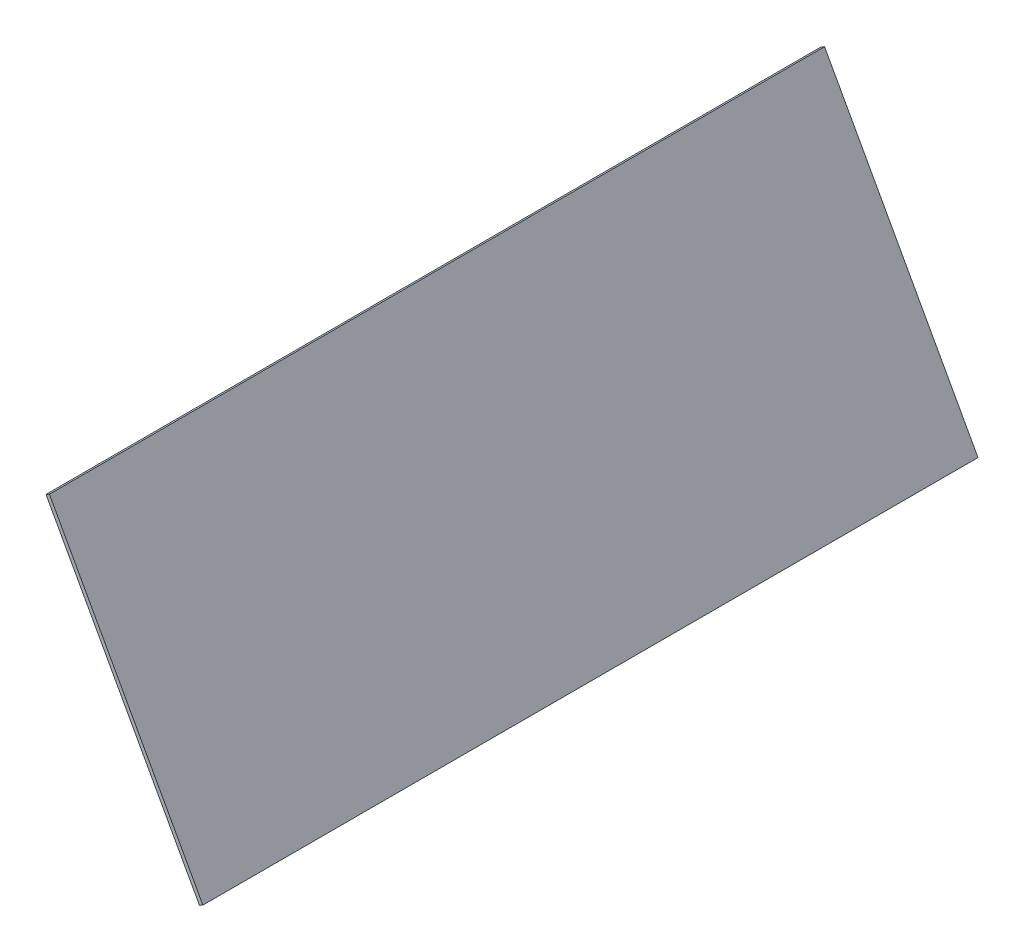
ISO-10303-21;
HEADER;
FILE_DESCRIPTION(('STEP AP214'),'2;1');
FILE_NAME('part.step','',(''),(''),'','','');
FILE_SCHEMA(('AUTOMOTIVE_DESIGN { 1 0 10303 214 1 1 1 1 }'));
ENDSEC;
DATA;
#1=APPLICATION_CONTEXT('core data for automotive mechanical design processes');
#2=APPLICATION_PROTOCOL_DEFINITION('international standard','automotive_design',2000,#1);
#3=PRODUCT_CONTEXT('',#1,'mechanical');
#4=PRODUCT('Part','Part','',(#3));
#5=PRODUCT_RELATED_PRODUCT_CATEGORY('part','',(#4));
#6=PRODUCT_DEFINITION_FORMATION('','',#4);
#7=PRODUCT_DEFINITION_CONTEXT('part definition',#1,'design');
#8=PRODUCT_DEFINITION('design','',#6,#7);
#9=PRODUCT_DEFINITION_SHAPE('','',#8);
#10=(LENGTH_UNIT() NAMED_UNIT(*) SI_UNIT(.MILLI.,.METRE.));
#11=(NAMED_UNIT(*) PLANE_ANGLE_UNIT() SI_UNIT($,.RADIAN.));
#12=(NAMED_UNIT(*) SI_UNIT($,.STERADIAN.) SOLID_ANGLE_UNIT());
#13=UNCERTAINTY_MEASURE_WITH_UNIT(LENGTH_MEASURE(1.E-05),#10,'distance_accuracy_value','');
#14=(GEOMETRIC_REPRESENTATION_CONTEXT(3) GLOBAL_UNCERTAINTY_ASSIGNED_CONTEXT((#13)) GLOBAL_UNIT_ASSIGNED_CONTEXT((#10,
#11,#12)) REPRESENTATION_CONTEXT('',''));
#15=CARTESIAN_POINT('',(0.,0.,0.));
#16=DIRECTION('',(0.,0.,1.));
#17=DIRECTION('',(1.,0.,0.));
#18=AXIS2_PLACEMENT_3D('',#15,#16,#17);
#19=CARTESIAN_POINT('',(93.2,35.7,198.));
#20=DIRECTION('',(0.876293743262213,0.481777205271792,0.));
#21=DIRECTION('',(-0.481777205271792,0.876293743262213,0.));
#22=AXIS2_PLACEMENT_3D('',#19,#20,#21);
#23=PLANE('',#22);
#24=DIRECTION('',(0.481777205271792,-0.876293743262213,0.));
#25=VECTOR('',#24,1.);
#26=CARTESIAN_POINT('',(93.2,35.7,0.));
#27=LINE('',#26,#25);
#28=CARTESIAN_POINT('',(54.,107.,0.));
#29=VERTEX_POINT('',#28);
#30=CARTESIAN_POINT('',(93.2,35.7,0.));
#31=VERTEX_POINT('',#30);
#32=EDGE_CURVE('E115',#29,#31,#27,.T.);
#33=ORIENTED_EDGE('',*,*,#32,.T.);
#34=DIRECTION('',(0.,0.,-1.));
#35=VECTOR('',#34,1.);
#36=CARTESIAN_POINT('',(93.2,35.7,198.));
#37=LINE('',#36,#35);
#38=CARTESIAN_POINT('',(93.2,35.7,198.));
#39=VERTEX_POINT('',#38);
#40=EDGE_CURVE('E11',#39,#31,#37,.T.);
#41=ORIENTED_EDGE('',*,*,#40,.F.);
#42=DIRECTION('',(0.481777205271792,-0.876293743262213,0.));
#43=VECTOR('',#42,1.);
#44=CARTESIAN_POINT('',(93.2,35.7,198.));
#45=LINE('',#44,#43);
#46=CARTESIAN_POINT('',(54.,107.,198.));
#47=VERTEX_POINT('',#46);
#48=EDGE_CURVE('E97',#47,#39,#45,.T.);
#49=ORIENTED_EDGE('',*,*,#48,.F.);
#50=DIRECTION('',(0.,0.,-1.));
#51=VECTOR('',#50,1.);
#52=CARTESIAN_POINT('',(54.,107.,198.));
#53=LINE('',#52,#51);
#54=EDGE_CURVE('E111',#47,#29,#53,.T.);
#55=ORIENTED_EDGE('',*,*,#54,.T.);
#56=EDGE_LOOP('',(#33,#41,#49,#55));
#57=FACE_BOUND('',#56,.T.);
#58=ADVANCED_FACE('F45',(#57),#23,.F.);
#59=CARTESIAN_POINT('',(94.07,36.18,198.));
#60=DIRECTION('',(-0.483077342911338,0.875577684026792,0.));
#61=DIRECTION('',(-0.875577684026793,-0.483077342911338,0.));
#62=AXIS2_PLACEMENT_3D('',#59,#60,#61);
#63=PLANE('',#62);
#64=DIRECTION('',(0.875577684026792,0.483077342911338,0.));
#65=VECTOR('',#64,1.);
#66=CARTESIAN_POINT('',(94.07,36.18,0.));
#67=LINE('',#66,#65);
#68=CARTESIAN_POINT('',(94.07,36.18,0.));
#69=VERTEX_POINT('',#68);
#70=EDGE_CURVE('E102',#31,#69,#67,.T.);
#71=ORIENTED_EDGE('',*,*,#70,.T.);
#72=DIRECTION('',(0.,0.,-1.));
#73=VECTOR('',#72,1.);
#74=CARTESIAN_POINT('',(94.07,36.18,198.));
#75=LINE('',#74,#73);
#76=CARTESIAN_POINT('',(94.07,36.18,198.));
#77=VERTEX_POINT('',#76);
#78=EDGE_CURVE('E54',#77,#69,#75,.T.);
#79=ORIENTED_EDGE('',*,*,#78,.F.);
#80=DIRECTION('',(0.875577684026792,0.483077342911338,0.));
#81=VECTOR('',#80,1.);
#82=CARTESIAN_POINT('',(94.07,36.18,198.));
#83=LINE('',#82,#81);
#84=EDGE_CURVE('E92',#39,#77,#83,.T.);
#85=ORIENTED_EDGE('',*,*,#84,.F.);
#86=ORIENTED_EDGE('',*,*,#40,.T.);
#87=EDGE_LOOP('',(#71,#79,#85,#86));
#88=FACE_BOUND('',#87,.T.);
#89=ADVANCED_FACE('F101',(#88),#63,.F.);
#90=CARTESIAN_POINT('',(54.87,107.48,198.));
#91=DIRECTION('',(-0.876293743262213,-0.481777205271792,0.));
#92=DIRECTION('',(0.481777205271792,-0.876293743262213,0.));
#93=AXIS2_PLACEMENT_3D('',#90,#91,#92);
#94=PLANE('',#93);
#95=DIRECTION('',(-0.481777205271792,0.876293743262213,0.));
#96=VECTOR('',#95,1.);
#97=CARTESIAN_POINT('',(54.87,107.48,0.));
#98=LINE('',#97,#96);
#99=CARTESIAN_POINT('',(54.87,107.48,0.));
#100=VERTEX_POINT('',#99);
#101=EDGE_CURVE('E79',#69,#100,#98,.T.);
#102=ORIENTED_EDGE('',*,*,#101,.T.);
#103=DIRECTION('',(0.,0.,-1.));
#104=VECTOR('',#103,1.);
#105=CARTESIAN_POINT('',(54.87,107.48,198.));
#106=LINE('',#105,#104);
#107=CARTESIAN_POINT('',(54.87,107.48,198.));
#108=VERTEX_POINT('',#107);
#109=EDGE_CURVE('E104',#108,#100,#106,.T.);
#110=ORIENTED_EDGE('',*,*,#109,.F.);
#111=DIRECTION('',(-0.481777205271792,0.876293743262213,0.));
#112=VECTOR('',#111,1.);
#113=CARTESIAN_POINT('',(54.87,107.48,198.));
#114=LINE('',#113,#112);
#115=EDGE_CURVE('E95',#77,#108,#114,.T.);
#116=ORIENTED_EDGE('',*,*,#115,.F.);
#117=ORIENTED_EDGE('',*,*,#78,.T.);
#118=EDGE_LOOP('',(#102,#110,#116,#117));
#119=FACE_BOUND('',#118,.T.);
#120=ADVANCED_FACE('F105',(#119),#94,.F.);
#121=CARTESIAN_POINT('',(54.,107.,198.));
#122=DIRECTION('',(0.483077342911343,-0.87557768402679,0.));
#123=DIRECTION('',(0.87557768402679,0.483077342911343,0.));
#124=AXIS2_PLACEMENT_3D('',#121,#122,#123);
#125=PLANE('',#124);
#126=DIRECTION('',(-0.87557768402679,-0.483077342911343,0.));
#127=VECTOR('',#126,1.);
#128=CARTESIAN_POINT('',(54.,107.,0.));
#129=LINE('',#128,#127);
#130=EDGE_CURVE('E85',#100,#29,#129,.T.);
#131=ORIENTED_EDGE('',*,*,#130,.T.);
#132=ORIENTED_EDGE('',*,*,#54,.F.);
#133=DIRECTION('',(-0.87557768402679,-0.483077342911343,0.));
#134=VECTOR('',#133,1.);
#135=CARTESIAN_POINT('',(54.,107.,198.));
#136=LINE('',#135,#134);
#137=EDGE_CURVE('E62',#108,#47,#136,.T.);
#138=ORIENTED_EDGE('',*,*,#137,.F.);
#139=ORIENTED_EDGE('',*,*,#109,.T.);
#140=EDGE_LOOP('',(#131,#132,#138,#139));
#141=FACE_BOUND('',#140,.T.);
#142=ADVANCED_FACE('F126',(#141),#125,.F.);
#143=CARTESIAN_POINT('',(0.,0.,198.));
#144=DIRECTION('',(0.,0.,-1.));
#145=DIRECTION('',(-1.,0.,0.));
#146=AXIS2_PLACEMENT_3D('',#143,#144,#145);
#147=PLANE('',#146);
#148=ORIENTED_EDGE('',*,*,#48,.T.);
#149=ORIENTED_EDGE('',*,*,#84,.T.);
#150=ORIENTED_EDGE('',*,*,#115,.T.);
#151=ORIENTED_EDGE('',*,*,#137,.T.);
#152=EDGE_LOOP('',(#148,#149,#150,#151));
#153=FACE_BOUND('',#152,.T.);
#154=ADVANCED_FACE('F93',(#153),#147,.F.);
#155=CARTESIAN_POINT('',(0.,0.,0.));
#156=DIRECTION('',(0.,0.,-1.));
#157=DIRECTION('',(-1.,0.,0.));
#158=AXIS2_PLACEMENT_3D('',#155,#156,#157);
#159=PLANE('',#158);
#160=ORIENTED_EDGE('',*,*,#32,.F.);
#161=ORIENTED_EDGE('',*,*,#130,.F.);
#162=ORIENTED_EDGE('',*,*,#101,.F.);
#163=ORIENTED_EDGE('',*,*,#70,.F.);
#164=EDGE_LOOP('',(#160,#161,#162,#163));
#165=FACE_BOUND('',#164,.T.);
#166=ADVANCED_FACE('F129',(#165),#159,.T.);
#167=CLOSED_SHELL('',(#58,#89,#120,#142,#154,#166));
#168=MANIFOLD_SOLID_BREP('B2',#167);
#169=ADVANCED_BREP_SHAPE_REPRESENTATION('',(#18,#168),#14);
#170=SHAPE_DEFINITION_REPRESENTATION(#9,#169);
ENDSEC;
END-ISO-10303-21;
